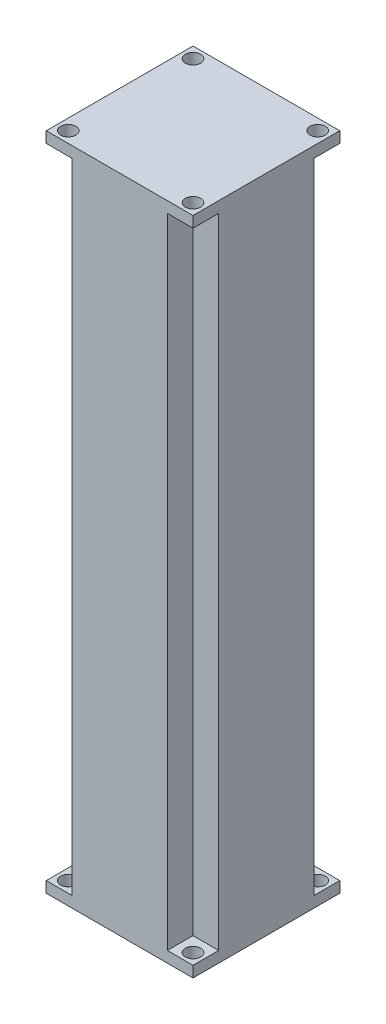
ISO-10303-21;
HEADER;
FILE_DESCRIPTION(('STEP AP214'),'2;1');
FILE_NAME('part.step','',(''),(''),'','','');
FILE_SCHEMA(('AUTOMOTIVE_DESIGN { 1 0 10303 214 1 1 1 1 }'));
ENDSEC;
DATA;
#1=APPLICATION_CONTEXT('core data for automotive mechanical design processes');
#2=APPLICATION_PROTOCOL_DEFINITION('international standard','automotive_design',2000,#1);
#3=PRODUCT_CONTEXT('',#1,'mechanical');
#4=PRODUCT('Part','Part','',(#3));
#5=PRODUCT_RELATED_PRODUCT_CATEGORY('part','',(#4));
#6=PRODUCT_DEFINITION_FORMATION('','',#4);
#7=PRODUCT_DEFINITION_CONTEXT('part definition',#1,'design');
#8=PRODUCT_DEFINITION('design','',#6,#7);
#9=PRODUCT_DEFINITION_SHAPE('','',#8);
#10=(LENGTH_UNIT() NAMED_UNIT(*) SI_UNIT(.MILLI.,.METRE.));
#11=(NAMED_UNIT(*) PLANE_ANGLE_UNIT() SI_UNIT($,.RADIAN.));
#12=(NAMED_UNIT(*) SI_UNIT($,.STERADIAN.) SOLID_ANGLE_UNIT());
#13=UNCERTAINTY_MEASURE_WITH_UNIT(LENGTH_MEASURE(1.E-05),#10,'distance_accuracy_value','');
#14=(GEOMETRIC_REPRESENTATION_CONTEXT(3) GLOBAL_UNCERTAINTY_ASSIGNED_CONTEXT((#13)) GLOBAL_UNIT_ASSIGNED_CONTEXT((#10,
#11,#12)) REPRESENTATION_CONTEXT('',''));
#15=CARTESIAN_POINT('',(0.,0.,0.));
#16=DIRECTION('',(0.,0.,1.));
#17=DIRECTION('',(1.,0.,0.));
#18=AXIS2_PLACEMENT_3D('',#15,#16,#17);
#19=CARTESIAN_POINT('',(-25.4,228.6,25.4));
#20=DIRECTION('',(-1.,0.,0.));
#21=DIRECTION('',(0.,0.,1.));
#22=AXIS2_PLACEMENT_3D('',#19,#20,#21);
#23=PLANE('',#22);
#24=DIRECTION('',(0.,1.,0.));
#25=VECTOR('',#24,1.);
#26=CARTESIAN_POINT('',(-25.4,3.81000000000001,-16.51));
#27=LINE('',#26,#25);
#28=CARTESIAN_POINT('',(-25.4,3.81000000000001,-16.51));
#29=VERTEX_POINT('',#28);
#30=CARTESIAN_POINT('',(-25.4,224.79,-16.51));
#31=VERTEX_POINT('',#30);
#32=EDGE_CURVE('E187',#29,#31,#27,.T.);
#33=ORIENTED_EDGE('',*,*,#32,.F.);
#34=DIRECTION('',(0.,0.,-1.));
#35=VECTOR('',#34,1.);
#36=CARTESIAN_POINT('',(-25.4,3.81000000000001,-16.51));
#37=LINE('',#36,#35);
#38=CARTESIAN_POINT('',(-25.4,3.81000000000001,-25.4));
#39=VERTEX_POINT('',#38);
#40=EDGE_CURVE('E225',#29,#39,#37,.T.);
#41=ORIENTED_EDGE('',*,*,#40,.T.);
#42=DIRECTION('',(0.,-1.,0.));
#43=VECTOR('',#42,1.);
#44=CARTESIAN_POINT('',(-25.4,228.6,-25.4));
#45=LINE('',#44,#43);
#46=CARTESIAN_POINT('',(-25.4,0.,-25.4));
#47=VERTEX_POINT('',#46);
#48=EDGE_CURVE('E329',#39,#47,#45,.T.);
#49=ORIENTED_EDGE('',*,*,#48,.T.);
#50=DIRECTION('',(0.,0.,-1.));
#51=VECTOR('',#50,1.);
#52=CARTESIAN_POINT('',(-25.4,0.,25.4));
#53=LINE('',#52,#51);
#54=CARTESIAN_POINT('',(-25.4,0.,25.4));
#55=VERTEX_POINT('',#54);
#56=EDGE_CURVE('E314',#55,#47,#53,.T.);
#57=ORIENTED_EDGE('',*,*,#56,.F.);
#58=DIRECTION('',(0.,-1.,0.));
#59=VECTOR('',#58,1.);
#60=CARTESIAN_POINT('',(-25.4,228.6,25.4));
#61=LINE('',#60,#59);
#62=CARTESIAN_POINT('',(-25.4,3.81000000000001,25.4));
#63=VERTEX_POINT('',#62);
#64=EDGE_CURVE('E315',#63,#55,#61,.T.);
#65=ORIENTED_EDGE('',*,*,#64,.F.);
#66=DIRECTION('',(0.,0.,1.));
#67=VECTOR('',#66,1.);
#68=CARTESIAN_POINT('',(-25.4,3.81000000000001,16.51));
#69=LINE('',#68,#67);
#70=CARTESIAN_POINT('',(-25.4,3.81000000000001,16.51));
#71=VERTEX_POINT('',#70);
#72=EDGE_CURVE('E216',#71,#63,#69,.T.);
#73=ORIENTED_EDGE('',*,*,#72,.F.);
#74=DIRECTION('',(0.,1.,0.));
#75=VECTOR('',#74,1.);
#76=CARTESIAN_POINT('',(-25.4,3.81000000000001,16.51));
#77=LINE('',#76,#75);
#78=CARTESIAN_POINT('',(-25.4,224.79,16.51));
#79=VERTEX_POINT('',#78);
#80=EDGE_CURVE('E210',#71,#79,#77,.T.);
#81=ORIENTED_EDGE('',*,*,#80,.T.);
#82=DIRECTION('',(0.,0.,1.));
#83=VECTOR('',#82,1.);
#84=CARTESIAN_POINT('',(-25.4,224.79,16.51));
#85=LINE('',#84,#83);
#86=CARTESIAN_POINT('',(-25.4,224.79,25.4));
#87=VERTEX_POINT('',#86);
#88=EDGE_CURVE('E61',#79,#87,#85,.T.);
#89=ORIENTED_EDGE('',*,*,#88,.T.);
#90=CARTESIAN_POINT('',(-25.4,228.6,25.4));
#91=VERTEX_POINT('',#90);
#92=EDGE_CURVE('E43',#91,#87,#61,.T.);
#93=ORIENTED_EDGE('',*,*,#92,.F.);
#94=DIRECTION('',(0.,0.,-1.));
#95=VECTOR('',#94,1.);
#96=CARTESIAN_POINT('',(-25.4,228.6,25.4));
#97=LINE('',#96,#95);
#98=CARTESIAN_POINT('',(-25.4,228.6,-25.4));
#99=VERTEX_POINT('',#98);
#100=EDGE_CURVE('E304',#91,#99,#97,.T.);
#101=ORIENTED_EDGE('',*,*,#100,.T.);
#102=CARTESIAN_POINT('',(-25.4,224.79,-25.4));
#103=VERTEX_POINT('',#102);
#104=EDGE_CURVE('E197',#99,#103,#45,.T.);
#105=ORIENTED_EDGE('',*,*,#104,.T.);
#106=DIRECTION('',(0.,0.,-1.));
#107=VECTOR('',#106,1.);
#108=CARTESIAN_POINT('',(-25.4,224.79,-16.51));
#109=LINE('',#108,#107);
#110=EDGE_CURVE('E179',#31,#103,#109,.T.);
#111=ORIENTED_EDGE('',*,*,#110,.F.);
#112=EDGE_LOOP('',(#33,#41,#49,#57,#65,#73,#81,#89,#93,#101,#105,#111));
#113=FACE_BOUND('',#112,.T.);
#114=ADVANCED_FACE('F39',(#113),#23,.T.);
#115=CARTESIAN_POINT('',(25.4,228.6,-25.4));
#116=DIRECTION('',(0.,0.,1.));
#117=DIRECTION('',(1.,0.,0.));
#118=AXIS2_PLACEMENT_3D('',#115,#116,#117);
#119=PLANE('',#118);
#120=DIRECTION('',(1.,0.,0.));
#121=VECTOR('',#120,1.);
#122=CARTESIAN_POINT('',(-25.4,224.79,-25.4));
#123=LINE('',#122,#121);
#124=CARTESIAN_POINT('',(-16.51,224.79,-25.4));
#125=VERTEX_POINT('',#124);
#126=EDGE_CURVE('E57',#103,#125,#123,.T.);
#127=ORIENTED_EDGE('',*,*,#126,.F.);
#128=ORIENTED_EDGE('',*,*,#104,.F.);
#129=DIRECTION('',(-1.,0.,0.));
#130=VECTOR('',#129,1.);
#131=CARTESIAN_POINT('',(25.4,228.6,-25.4));
#132=LINE('',#131,#130);
#133=CARTESIAN_POINT('',(25.4,228.6,-25.4));
#134=VERTEX_POINT('',#133);
#135=EDGE_CURVE('E308',#134,#99,#132,.T.);
#136=ORIENTED_EDGE('',*,*,#135,.F.);
#137=DIRECTION('',(0.,-1.,0.));
#138=VECTOR('',#137,1.);
#139=CARTESIAN_POINT('',(25.4,228.6,-25.4));
#140=LINE('',#139,#138);
#141=CARTESIAN_POINT('',(25.4,224.79,-25.4));
#142=VERTEX_POINT('',#141);
#143=EDGE_CURVE('E324',#134,#142,#140,.T.);
#144=ORIENTED_EDGE('',*,*,#143,.T.);
#145=DIRECTION('',(-1.,0.,0.));
#146=VECTOR('',#145,1.);
#147=CARTESIAN_POINT('',(25.4,224.79,-25.4));
#148=LINE('',#147,#146);
#149=CARTESIAN_POINT('',(16.51,224.79,-25.4));
#150=VERTEX_POINT('',#149);
#151=EDGE_CURVE('E238',#142,#150,#148,.T.);
#152=ORIENTED_EDGE('',*,*,#151,.T.);
#153=DIRECTION('',(0.,-1.,0.));
#154=VECTOR('',#153,1.);
#155=CARTESIAN_POINT('',(16.51,3.81,-25.4));
#156=LINE('',#155,#154);
#157=CARTESIAN_POINT('',(16.51,3.81000000000001,-25.4));
#158=VERTEX_POINT('',#157);
#159=EDGE_CURVE('E250',#150,#158,#156,.T.);
#160=ORIENTED_EDGE('',*,*,#159,.T.);
#161=DIRECTION('',(1.,0.,0.));
#162=VECTOR('',#161,1.);
#163=CARTESIAN_POINT('',(25.4,3.81000000000001,-25.4));
#164=LINE('',#163,#162);
#165=CARTESIAN_POINT('',(25.4,3.81000000000001,-25.4));
#166=VERTEX_POINT('',#165);
#167=EDGE_CURVE('E226',#158,#166,#164,.T.);
#168=ORIENTED_EDGE('',*,*,#167,.T.);
#169=CARTESIAN_POINT('',(25.4,0.,-25.4));
#170=VERTEX_POINT('',#169);
#171=EDGE_CURVE('E323',#166,#170,#140,.T.);
#172=ORIENTED_EDGE('',*,*,#171,.T.);
#173=DIRECTION('',(-1.,0.,0.));
#174=VECTOR('',#173,1.);
#175=CARTESIAN_POINT('',(25.4,0.,-25.4));
#176=LINE('',#175,#174);
#177=EDGE_CURVE('E319',#170,#47,#176,.T.);
#178=ORIENTED_EDGE('',*,*,#177,.T.);
#179=ORIENTED_EDGE('',*,*,#48,.F.);
#180=DIRECTION('',(-1.,0.,0.));
#181=VECTOR('',#180,1.);
#182=CARTESIAN_POINT('',(-25.4,3.81000000000001,-25.4));
#183=LINE('',#182,#181);
#184=CARTESIAN_POINT('',(-16.51,3.81,-25.4));
#185=VERTEX_POINT('',#184);
#186=EDGE_CURVE('E193',#185,#39,#183,.T.);
#187=ORIENTED_EDGE('',*,*,#186,.F.);
#188=DIRECTION('',(0.,-1.,0.));
#189=VECTOR('',#188,1.);
#190=CARTESIAN_POINT('',(-16.51,3.81,-25.4));
#191=LINE('',#190,#189);
#192=EDGE_CURVE('E456',#125,#185,#191,.T.);
#193=ORIENTED_EDGE('',*,*,#192,.F.);
#194=EDGE_LOOP('',(#127,#128,#136,#144,#152,#160,#168,#172,#178,#179,#187,#193));
#195=FACE_BOUND('',#194,.T.);
#196=ADVANCED_FACE('F394',(#195),#119,.F.);
#197=CARTESIAN_POINT('',(25.4,228.6,25.4));
#198=DIRECTION('',(0.,0.,1.));
#199=DIRECTION('',(1.,0.,0.));
#200=AXIS2_PLACEMENT_3D('',#197,#198,#199);
#201=PLANE('',#200);
#202=DIRECTION('',(0.,-1.,0.));
#203=VECTOR('',#202,1.);
#204=CARTESIAN_POINT('',(-16.51,3.81,25.4));
#205=LINE('',#204,#203);
#206=CARTESIAN_POINT('',(-16.51,224.79,25.4));
#207=VERTEX_POINT('',#206);
#208=CARTESIAN_POINT('',(-16.51,3.81,25.4));
#209=VERTEX_POINT('',#208);
#210=EDGE_CURVE('E222',#207,#209,#205,.T.);
#211=ORIENTED_EDGE('',*,*,#210,.T.);
#212=DIRECTION('',(-1.,0.,0.));
#213=VECTOR('',#212,1.);
#214=CARTESIAN_POINT('',(-25.4,3.81000000000001,25.4));
#215=LINE('',#214,#213);
#216=EDGE_CURVE('E220',#209,#63,#215,.T.);
#217=ORIENTED_EDGE('',*,*,#216,.T.);
#218=ORIENTED_EDGE('',*,*,#64,.T.);
#219=DIRECTION('',(-1.,0.,0.));
#220=VECTOR('',#219,1.);
#221=CARTESIAN_POINT('',(25.4,0.,25.4));
#222=LINE('',#221,#220);
#223=CARTESIAN_POINT('',(25.4,0.,25.4));
#224=VERTEX_POINT('',#223);
#225=EDGE_CURVE('E298',#224,#55,#222,.T.);
#226=ORIENTED_EDGE('',*,*,#225,.F.);
#227=DIRECTION('',(0.,-1.,0.));
#228=VECTOR('',#227,1.);
#229=CARTESIAN_POINT('',(25.4,228.6,25.4));
#230=LINE('',#229,#228);
#231=CARTESIAN_POINT('',(25.4,3.81000000000001,25.4));
#232=VERTEX_POINT('',#231);
#233=EDGE_CURVE('E48',#232,#224,#230,.T.);
#234=ORIENTED_EDGE('',*,*,#233,.F.);
#235=DIRECTION('',(1.,0.,0.));
#236=VECTOR('',#235,1.);
#237=CARTESIAN_POINT('',(25.4,3.81000000000001,25.4));
#238=LINE('',#237,#236);
#239=CARTESIAN_POINT('',(16.51,3.81,25.4));
#240=VERTEX_POINT('',#239);
#241=EDGE_CURVE('E279',#240,#232,#238,.T.);
#242=ORIENTED_EDGE('',*,*,#241,.F.);
#243=DIRECTION('',(0.,-1.,0.));
#244=VECTOR('',#243,1.);
#245=CARTESIAN_POINT('',(16.51,3.81,25.4));
#246=LINE('',#245,#244);
#247=CARTESIAN_POINT('',(16.51,224.79,25.4));
#248=VERTEX_POINT('',#247);
#249=EDGE_CURVE('E286',#248,#240,#246,.T.);
#250=ORIENTED_EDGE('',*,*,#249,.F.);
#251=DIRECTION('',(-1.,0.,0.));
#252=VECTOR('',#251,1.);
#253=CARTESIAN_POINT('',(25.4,224.79,25.4));
#254=LINE('',#253,#252);
#255=CARTESIAN_POINT('',(25.4,224.79,25.4));
#256=VERTEX_POINT('',#255);
#257=EDGE_CURVE('E271',#256,#248,#254,.T.);
#258=ORIENTED_EDGE('',*,*,#257,.F.);
#259=CARTESIAN_POINT('',(25.4,228.6,25.4));
#260=VERTEX_POINT('',#259);
#261=EDGE_CURVE('E11',#260,#256,#230,.T.);
#262=ORIENTED_EDGE('',*,*,#261,.F.);
#263=DIRECTION('',(-1.,0.,0.));
#264=VECTOR('',#263,1.);
#265=CARTESIAN_POINT('',(25.4,228.6,25.4));
#266=LINE('',#265,#264);
#267=EDGE_CURVE('E305',#260,#91,#266,.T.);
#268=ORIENTED_EDGE('',*,*,#267,.T.);
#269=ORIENTED_EDGE('',*,*,#92,.T.);
#270=DIRECTION('',(1.,0.,0.));
#271=VECTOR('',#270,1.);
#272=CARTESIAN_POINT('',(-25.4,224.79,25.4));
#273=LINE('',#272,#271);
#274=EDGE_CURVE('E212',#87,#207,#273,.T.);
#275=ORIENTED_EDGE('',*,*,#274,.T.);
#276=EDGE_LOOP('',(#211,#217,#218,#226,#234,#242,#250,#258,#262,#268,#269,#275));
#277=FACE_BOUND('',#276,.T.);
#278=ADVANCED_FACE('F41',(#277),#201,.T.);
#279=CARTESIAN_POINT('',(25.4,228.6,25.4));
#280=DIRECTION('',(-1.,0.,0.));
#281=DIRECTION('',(0.,0.,1.));
#282=AXIS2_PLACEMENT_3D('',#279,#280,#281);
#283=PLANE('',#282);
#284=DIRECTION('',(0.,1.,0.));
#285=VECTOR('',#284,1.);
#286=CARTESIAN_POINT('',(25.4,3.81000000000001,-16.51));
#287=LINE('',#286,#285);
#288=CARTESIAN_POINT('',(25.4,3.81000000000001,-16.51));
#289=VERTEX_POINT('',#288);
#290=CARTESIAN_POINT('',(25.4,224.79,-16.51));
#291=VERTEX_POINT('',#290);
#292=EDGE_CURVE('E234',#289,#291,#287,.T.);
#293=ORIENTED_EDGE('',*,*,#292,.T.);
#294=DIRECTION('',(0.,0.,-1.));
#295=VECTOR('',#294,1.);
#296=CARTESIAN_POINT('',(25.4,224.79,-16.51));
#297=LINE('',#296,#295);
#298=EDGE_CURVE('E255',#291,#142,#297,.T.);
#299=ORIENTED_EDGE('',*,*,#298,.T.);
#300=ORIENTED_EDGE('',*,*,#143,.F.);
#301=DIRECTION('',(0.,0.,-1.));
#302=VECTOR('',#301,1.);
#303=CARTESIAN_POINT('',(25.4,228.6,25.4));
#304=LINE('',#303,#302);
#305=EDGE_CURVE('E309',#260,#134,#304,.T.);
#306=ORIENTED_EDGE('',*,*,#305,.F.);
#307=ORIENTED_EDGE('',*,*,#261,.T.);
#308=DIRECTION('',(0.,0.,1.));
#309=VECTOR('',#308,1.);
#310=CARTESIAN_POINT('',(25.4,224.79,16.51));
#311=LINE('',#310,#309);
#312=CARTESIAN_POINT('',(25.4,224.79,16.51));
#313=VERTEX_POINT('',#312);
#314=EDGE_CURVE('E287',#313,#256,#311,.T.);
#315=ORIENTED_EDGE('',*,*,#314,.F.);
#316=DIRECTION('',(0.,1.,0.));
#317=VECTOR('',#316,1.);
#318=CARTESIAN_POINT('',(25.4,3.81000000000001,16.51));
#319=LINE('',#318,#317);
#320=CARTESIAN_POINT('',(25.4,3.81000000000001,16.51));
#321=VERTEX_POINT('',#320);
#322=EDGE_CURVE('E274',#321,#313,#319,.T.);
#323=ORIENTED_EDGE('',*,*,#322,.F.);
#324=DIRECTION('',(0.,0.,1.));
#325=VECTOR('',#324,1.);
#326=CARTESIAN_POINT('',(25.4,3.81000000000001,16.51));
#327=LINE('',#326,#325);
#328=EDGE_CURVE('E291',#321,#232,#327,.T.);
#329=ORIENTED_EDGE('',*,*,#328,.T.);
#330=ORIENTED_EDGE('',*,*,#233,.T.);
#331=DIRECTION('',(0.,0.,-1.));
#332=VECTOR('',#331,1.);
#333=CARTESIAN_POINT('',(25.4,0.,25.4));
#334=LINE('',#333,#332);
#335=EDGE_CURVE('E306',#224,#170,#334,.T.);
#336=ORIENTED_EDGE('',*,*,#335,.T.);
#337=ORIENTED_EDGE('',*,*,#171,.F.);
#338=DIRECTION('',(0.,0.,-1.));
#339=VECTOR('',#338,1.);
#340=CARTESIAN_POINT('',(25.4,3.81000000000001,-16.51));
#341=LINE('',#340,#339);
#342=EDGE_CURVE('E242',#289,#166,#341,.T.);
#343=ORIENTED_EDGE('',*,*,#342,.F.);
#344=EDGE_LOOP('',(#293,#299,#300,#306,#307,#315,#323,#329,#330,#336,#337,#343));
#345=FACE_BOUND('',#344,.T.);
#346=ADVANCED_FACE('F345',(#345),#283,.F.);
#347=CARTESIAN_POINT('',(0.,228.6,0.));
#348=DIRECTION('',(0.,-1.,0.));
#349=DIRECTION('',(0.,0.,-1.));
#350=AXIS2_PLACEMENT_3D('',#347,#348,#349);
#351=PLANE('',#350);
#352=CARTESIAN_POINT('',(-21.59,228.6,-21.59));
#353=DIRECTION('',(0.,-1.,0.));
#354=DIRECTION('',(0.,0.,-1.));
#355=AXIS2_PLACEMENT_3D('',#352,#353,#354);
#356=CIRCLE('',#355,2.6543);
#357=CARTESIAN_POINT('',(-21.59,228.6,-24.2443));
#358=VERTEX_POINT('',#357);
#359=EDGE_CURVE('E500',#358,#358,#356,.T.);
#360=ORIENTED_EDGE('',*,*,#359,.T.);
#361=EDGE_LOOP('',(#360));
#362=FACE_BOUND('',#361,.T.);
#363=CARTESIAN_POINT('',(-21.59,228.6,21.59));
#364=DIRECTION('',(0.,-1.,0.));
#365=DIRECTION('',(0.,0.,-1.));
#366=AXIS2_PLACEMENT_3D('',#363,#364,#365);
#367=CIRCLE('',#366,2.6543);
#368=CARTESIAN_POINT('',(-21.59,228.6,18.9357));
#369=VERTEX_POINT('',#368);
#370=EDGE_CURVE('E493',#369,#369,#367,.T.);
#371=ORIENTED_EDGE('',*,*,#370,.T.);
#372=EDGE_LOOP('',(#371));
#373=FACE_BOUND('',#372,.T.);
#374=CARTESIAN_POINT('',(21.59,228.6,-21.59));
#375=DIRECTION('',(0.,-1.,0.));
#376=DIRECTION('',(0.,0.,-1.));
#377=AXIS2_PLACEMENT_3D('',#374,#375,#376);
#378=CIRCLE('',#377,2.6543);
#379=CARTESIAN_POINT('',(21.59,228.6,-24.2443));
#380=VERTEX_POINT('',#379);
#381=EDGE_CURVE('E483',#380,#380,#378,.T.);
#382=ORIENTED_EDGE('',*,*,#381,.T.);
#383=EDGE_LOOP('',(#382));
#384=FACE_BOUND('',#383,.T.);
#385=CARTESIAN_POINT('',(21.59,228.6,21.59));
#386=DIRECTION('',(0.,-1.,0.));
#387=DIRECTION('',(0.,0.,-1.));
#388=AXIS2_PLACEMENT_3D('',#385,#386,#387);
#389=CIRCLE('',#388,2.6543);
#390=CARTESIAN_POINT('',(21.59,228.6,18.9357));
#391=VERTEX_POINT('',#390);
#392=EDGE_CURVE('E263',#391,#391,#389,.T.);
#393=ORIENTED_EDGE('',*,*,#392,.T.);
#394=EDGE_LOOP('',(#393));
#395=FACE_BOUND('',#394,.T.);
#396=ORIENTED_EDGE('',*,*,#267,.F.);
#397=ORIENTED_EDGE('',*,*,#305,.T.);
#398=ORIENTED_EDGE('',*,*,#135,.T.);
#399=ORIENTED_EDGE('',*,*,#100,.F.);
#400=EDGE_LOOP('',(#396,#397,#398,#399));
#401=FACE_BOUND('',#400,.T.);
#402=ADVANCED_FACE('F364',(#362,#373,#384,#395,#401),#351,.F.);
#403=CARTESIAN_POINT('',(0.,0.,0.));
#404=DIRECTION('',(0.,-1.,0.));
#405=DIRECTION('',(0.,0.,-1.));
#406=AXIS2_PLACEMENT_3D('',#403,#404,#405);
#407=PLANE('',#406);
#408=CARTESIAN_POINT('',(-21.59,0.,-21.59));
#409=DIRECTION('',(0.,1.,0.));
#410=DIRECTION('',(0.,0.,1.));
#411=AXIS2_PLACEMENT_3D('',#408,#409,#410);
#412=CIRCLE('',#411,2.6543);
#413=CARTESIAN_POINT('',(-21.59,0.,-18.9357));
#414=VERTEX_POINT('',#413);
#415=EDGE_CURVE('E478',#414,#414,#412,.T.);
#416=ORIENTED_EDGE('',*,*,#415,.T.);
#417=EDGE_LOOP('',(#416));
#418=FACE_BOUND('',#417,.T.);
#419=CARTESIAN_POINT('',(-21.59,0.,21.59));
#420=DIRECTION('',(0.,1.,0.));
#421=DIRECTION('',(0.,0.,1.));
#422=AXIS2_PLACEMENT_3D('',#419,#420,#421);
#423=CIRCLE('',#422,2.6543);
#424=CARTESIAN_POINT('',(-21.59,0.,24.2443));
#425=VERTEX_POINT('',#424);
#426=EDGE_CURVE('E474',#425,#425,#423,.T.);
#427=ORIENTED_EDGE('',*,*,#426,.T.);
#428=EDGE_LOOP('',(#427));
#429=FACE_BOUND('',#428,.T.);
#430=CARTESIAN_POINT('',(21.59,0.,-21.59));
#431=DIRECTION('',(0.,1.,0.));
#432=DIRECTION('',(0.,0.,1.));
#433=AXIS2_PLACEMENT_3D('',#430,#431,#432);
#434=CIRCLE('',#433,2.6543);
#435=CARTESIAN_POINT('',(21.59,0.,-18.9357));
#436=VERTEX_POINT('',#435);
#437=EDGE_CURVE('E460',#436,#436,#434,.T.);
#438=ORIENTED_EDGE('',*,*,#437,.T.);
#439=EDGE_LOOP('',(#438));
#440=FACE_BOUND('',#439,.T.);
#441=CARTESIAN_POINT('',(21.59,0.,21.59));
#442=DIRECTION('',(0.,1.,0.));
#443=DIRECTION('',(0.,0.,1.));
#444=AXIS2_PLACEMENT_3D('',#441,#442,#443);
#445=CIRCLE('',#444,2.6543);
#446=CARTESIAN_POINT('',(21.59,0.,24.2443));
#447=VERTEX_POINT('',#446);
#448=EDGE_CURVE('E268',#447,#447,#445,.T.);
#449=ORIENTED_EDGE('',*,*,#448,.T.);
#450=EDGE_LOOP('',(#449));
#451=FACE_BOUND('',#450,.T.);
#452=ORIENTED_EDGE('',*,*,#225,.T.);
#453=ORIENTED_EDGE('',*,*,#56,.T.);
#454=ORIENTED_EDGE('',*,*,#177,.F.);
#455=ORIENTED_EDGE('',*,*,#335,.F.);
#456=EDGE_LOOP('',(#452,#453,#454,#455));
#457=FACE_BOUND('',#456,.T.);
#458=ADVANCED_FACE('F339',(#418,#429,#440,#451,#457),#407,.T.);
#459=CARTESIAN_POINT('',(25.4,3.81000000000001,16.51));
#460=DIRECTION('',(0.,-1.,0.));
#461=DIRECTION('',(1.,0.,0.));
#462=AXIS2_PLACEMENT_3D('',#459,#460,#461);
#463=PLANE('',#462);
#464=CARTESIAN_POINT('',(21.59,3.81,21.59));
#465=DIRECTION('',(0.,1.,0.));
#466=DIRECTION('',(0.,0.,1.));
#467=AXIS2_PLACEMENT_3D('',#464,#465,#466);
#468=CIRCLE('',#467,2.65429999999999);
#469=CARTESIAN_POINT('',(21.59,3.81,24.2443));
#470=VERTEX_POINT('',#469);
#471=EDGE_CURVE('E270',#470,#470,#468,.T.);
#472=ORIENTED_EDGE('',*,*,#471,.F.);
#473=EDGE_LOOP('',(#472));
#474=FACE_BOUND('',#473,.T.);
#475=ORIENTED_EDGE('',*,*,#241,.T.);
#476=ORIENTED_EDGE('',*,*,#328,.F.);
#477=DIRECTION('',(1.,0.,0.));
#478=VECTOR('',#477,1.);
#479=CARTESIAN_POINT('',(25.4,3.81000000000001,16.51));
#480=LINE('',#479,#478);
#481=CARTESIAN_POINT('',(16.51,3.81,16.51));
#482=VERTEX_POINT('',#481);
#483=EDGE_CURVE('E283',#482,#321,#480,.T.);
#484=ORIENTED_EDGE('',*,*,#483,.F.);
#485=DIRECTION('',(0.,0.,1.));
#486=VECTOR('',#485,1.);
#487=CARTESIAN_POINT('',(16.51,3.81,16.51));
#488=LINE('',#487,#486);
#489=EDGE_CURVE('E300',#482,#240,#488,.T.);
#490=ORIENTED_EDGE('',*,*,#489,.T.);
#491=EDGE_LOOP('',(#475,#476,#484,#490));
#492=FACE_BOUND('',#491,.T.);
#493=ADVANCED_FACE('F347',(#474,#492),#463,.F.);
#494=CARTESIAN_POINT('',(16.51,3.81,16.51));
#495=DIRECTION('',(-1.,0.,0.));
#496=DIRECTION('',(0.,0.,1.));
#497=AXIS2_PLACEMENT_3D('',#494,#495,#496);
#498=PLANE('',#497);
#499=ORIENTED_EDGE('',*,*,#249,.T.);
#500=ORIENTED_EDGE('',*,*,#489,.F.);
#501=DIRECTION('',(0.,-1.,0.));
#502=VECTOR('',#501,1.);
#503=CARTESIAN_POINT('',(16.51,3.81,16.51));
#504=LINE('',#503,#502);
#505=CARTESIAN_POINT('',(16.51,224.79,16.51));
#506=VERTEX_POINT('',#505);
#507=EDGE_CURVE('E284',#506,#482,#504,.T.);
#508=ORIENTED_EDGE('',*,*,#507,.F.);
#509=DIRECTION('',(0.,0.,1.));
#510=VECTOR('',#509,1.);
#511=CARTESIAN_POINT('',(16.51,224.79,16.51));
#512=LINE('',#511,#510);
#513=EDGE_CURVE('E299',#506,#248,#512,.T.);
#514=ORIENTED_EDGE('',*,*,#513,.T.);
#515=EDGE_LOOP('',(#499,#500,#508,#514));
#516=FACE_BOUND('',#515,.T.);
#517=ADVANCED_FACE('F351',(#516),#498,.F.);
#518=CARTESIAN_POINT('',(25.4,224.79,16.51));
#519=DIRECTION('',(0.,1.,0.));
#520=DIRECTION('',(0.,0.,1.));
#521=AXIS2_PLACEMENT_3D('',#518,#519,#520);
#522=PLANE('',#521);
#523=CARTESIAN_POINT('',(21.59,224.79,21.59));
#524=DIRECTION('',(0.,-1.,0.));
#525=DIRECTION('',(0.,0.,-1.));
#526=AXIS2_PLACEMENT_3D('',#523,#524,#525);
#527=CIRCLE('',#526,2.65429999999999);
#528=CARTESIAN_POINT('',(21.59,224.79,18.9357));
#529=VERTEX_POINT('',#528);
#530=EDGE_CURVE('E253',#529,#529,#527,.T.);
#531=ORIENTED_EDGE('',*,*,#530,.F.);
#532=EDGE_LOOP('',(#531));
#533=FACE_BOUND('',#532,.T.);
#534=ORIENTED_EDGE('',*,*,#257,.T.);
#535=ORIENTED_EDGE('',*,*,#513,.F.);
#536=DIRECTION('',(-1.,0.,0.));
#537=VECTOR('',#536,1.);
#538=CARTESIAN_POINT('',(25.4,224.79,16.51));
#539=LINE('',#538,#537);
#540=EDGE_CURVE('E280',#313,#506,#539,.T.);
#541=ORIENTED_EDGE('',*,*,#540,.F.);
#542=ORIENTED_EDGE('',*,*,#314,.T.);
#543=EDGE_LOOP('',(#534,#535,#541,#542));
#544=FACE_BOUND('',#543,.T.);
#545=ADVANCED_FACE('F358',(#533,#544),#522,.F.);
#546=CARTESIAN_POINT('',(0.,0.,16.51));
#547=DIRECTION('',(0.,0.,1.));
#548=DIRECTION('',(1.,0.,0.));
#549=AXIS2_PLACEMENT_3D('',#546,#547,#548);
#550=PLANE('',#549);
#551=ORIENTED_EDGE('',*,*,#322,.T.);
#552=ORIENTED_EDGE('',*,*,#540,.T.);
#553=ORIENTED_EDGE('',*,*,#507,.T.);
#554=ORIENTED_EDGE('',*,*,#483,.T.);
#555=EDGE_LOOP('',(#551,#552,#553,#554));
#556=FACE_BOUND('',#555,.T.);
#557=ADVANCED_FACE('F406',(#556),#550,.T.);
#558=CARTESIAN_POINT('',(21.59,3.81,21.59));
#559=DIRECTION('',(0.,1.,0.));
#560=DIRECTION('',(0.,0.,1.));
#561=AXIS2_PLACEMENT_3D('',#558,#559,#560);
#562=CYLINDRICAL_SURFACE('',#561,2.65429999999999);
#563=ORIENTED_EDGE('',*,*,#448,.F.);
#564=EDGE_LOOP('',(#563));
#565=FACE_BOUND('',#564,.T.);
#566=ORIENTED_EDGE('',*,*,#471,.T.);
#567=EDGE_LOOP('',(#566));
#568=FACE_BOUND('',#567,.T.);
#569=ADVANCED_FACE('F419',(#565,#568),#562,.F.);
#570=CARTESIAN_POINT('',(21.59,224.79,21.59));
#571=DIRECTION('',(0.,-1.,0.));
#572=DIRECTION('',(0.,0.,-1.));
#573=AXIS2_PLACEMENT_3D('',#570,#571,#572);
#574=CYLINDRICAL_SURFACE('',#573,2.65429999999999);
#575=ORIENTED_EDGE('',*,*,#392,.F.);
#576=EDGE_LOOP('',(#575));
#577=FACE_BOUND('',#576,.T.);
#578=ORIENTED_EDGE('',*,*,#530,.T.);
#579=EDGE_LOOP('',(#578));
#580=FACE_BOUND('',#579,.T.);
#581=ADVANCED_FACE('F422',(#577,#580),#574,.F.);
#582=CARTESIAN_POINT('',(25.4,224.79,-16.51));
#583=DIRECTION('',(0.,-1.,0.));
#584=DIRECTION('',(0.,0.,-1.));
#585=AXIS2_PLACEMENT_3D('',#582,#583,#584);
#586=PLANE('',#585);
#587=CARTESIAN_POINT('',(21.59,224.79,-21.59));
#588=DIRECTION('',(0.,-1.,0.));
#589=DIRECTION('',(0.,0.,-1.));
#590=AXIS2_PLACEMENT_3D('',#587,#588,#589);
#591=CIRCLE('',#590,2.65429999999999);
#592=CARTESIAN_POINT('',(21.59,224.79,-24.2443));
#593=VERTEX_POINT('',#592);
#594=EDGE_CURVE('E486',#593,#593,#591,.T.);
#595=ORIENTED_EDGE('',*,*,#594,.F.);
#596=EDGE_LOOP('',(#595));
#597=FACE_BOUND('',#596,.T.);
#598=ORIENTED_EDGE('',*,*,#151,.F.);
#599=ORIENTED_EDGE('',*,*,#298,.F.);
#600=DIRECTION('',(-1.,0.,0.));
#601=VECTOR('',#600,1.);
#602=CARTESIAN_POINT('',(25.4,224.79,-16.51));
#603=LINE('',#602,#601);
#604=CARTESIAN_POINT('',(16.51,224.79,-16.51));
#605=VERTEX_POINT('',#604);
#606=EDGE_CURVE('E245',#291,#605,#603,.T.);
#607=ORIENTED_EDGE('',*,*,#606,.T.);
#608=DIRECTION('',(0.,0.,-1.));
#609=VECTOR('',#608,1.);
#610=CARTESIAN_POINT('',(16.51,224.79,-16.51));
#611=LINE('',#610,#609);
#612=EDGE_CURVE('E257',#605,#150,#611,.T.);
#613=ORIENTED_EDGE('',*,*,#612,.T.);
#614=EDGE_LOOP('',(#598,#599,#607,#613));
#615=FACE_BOUND('',#614,.T.);
#616=ADVANCED_FACE('F424',(#597,#615),#586,.T.);
#617=CARTESIAN_POINT('',(16.51,3.81,-16.51));
#618=DIRECTION('',(1.,0.,0.));
#619=DIRECTION('',(0.,0.,-1.));
#620=AXIS2_PLACEMENT_3D('',#617,#618,#619);
#621=PLANE('',#620);
#622=ORIENTED_EDGE('',*,*,#159,.F.);
#623=ORIENTED_EDGE('',*,*,#612,.F.);
#624=DIRECTION('',(0.,-1.,0.));
#625=VECTOR('',#624,1.);
#626=CARTESIAN_POINT('',(16.51,3.81,-16.51));
#627=LINE('',#626,#625);
#628=CARTESIAN_POINT('',(16.51,3.81,-16.51));
#629=VERTEX_POINT('',#628);
#630=EDGE_CURVE('E239',#605,#629,#627,.T.);
#631=ORIENTED_EDGE('',*,*,#630,.T.);
#632=DIRECTION('',(0.,0.,-1.));
#633=VECTOR('',#632,1.);
#634=CARTESIAN_POINT('',(16.51,3.81,-16.51));
#635=LINE('',#634,#633);
#636=EDGE_CURVE('E259',#629,#158,#635,.T.);
#637=ORIENTED_EDGE('',*,*,#636,.T.);
#638=EDGE_LOOP('',(#622,#623,#631,#637));
#639=FACE_BOUND('',#638,.T.);
#640=ADVANCED_FACE('F431',(#639),#621,.T.);
#641=CARTESIAN_POINT('',(25.4,3.81000000000001,-16.51));
#642=DIRECTION('',(0.,1.,0.));
#643=DIRECTION('',(-1.,0.,0.));
#644=AXIS2_PLACEMENT_3D('',#641,#642,#643);
#645=PLANE('',#644);
#646=CARTESIAN_POINT('',(21.59,3.81,-21.59));
#647=DIRECTION('',(0.,1.,0.));
#648=DIRECTION('',(0.,0.,1.));
#649=AXIS2_PLACEMENT_3D('',#646,#647,#648);
#650=CIRCLE('',#649,2.65429999999999);
#651=CARTESIAN_POINT('',(21.59,3.81,-18.9357));
#652=VERTEX_POINT('',#651);
#653=EDGE_CURVE('E465',#652,#652,#650,.T.);
#654=ORIENTED_EDGE('',*,*,#653,.F.);
#655=EDGE_LOOP('',(#654));
#656=FACE_BOUND('',#655,.T.);
#657=ORIENTED_EDGE('',*,*,#167,.F.);
#658=ORIENTED_EDGE('',*,*,#636,.F.);
#659=DIRECTION('',(1.,0.,0.));
#660=VECTOR('',#659,1.);
#661=CARTESIAN_POINT('',(25.4,3.81000000000001,-16.51));
#662=LINE('',#661,#660);
#663=EDGE_CURVE('E240',#629,#289,#662,.T.);
#664=ORIENTED_EDGE('',*,*,#663,.T.);
#665=ORIENTED_EDGE('',*,*,#342,.T.);
#666=EDGE_LOOP('',(#657,#658,#664,#665));
#667=FACE_BOUND('',#666,.T.);
#668=ADVANCED_FACE('F430',(#656,#667),#645,.T.);
#669=CARTESIAN_POINT('',(0.,0.,-16.51));
#670=DIRECTION('',(0.,0.,-1.));
#671=DIRECTION('',(1.,0.,0.));
#672=AXIS2_PLACEMENT_3D('',#669,#670,#671);
#673=PLANE('',#672);
#674=ORIENTED_EDGE('',*,*,#292,.F.);
#675=ORIENTED_EDGE('',*,*,#663,.F.);
#676=ORIENTED_EDGE('',*,*,#630,.F.);
#677=ORIENTED_EDGE('',*,*,#606,.F.);
#678=EDGE_LOOP('',(#674,#675,#676,#677));
#679=FACE_BOUND('',#678,.T.);
#680=ADVANCED_FACE('F427',(#679),#673,.T.);
#681=CARTESIAN_POINT('',(-25.4,224.79,16.51));
#682=DIRECTION('',(0.,-1.,0.));
#683=DIRECTION('',(0.,0.,-1.));
#684=AXIS2_PLACEMENT_3D('',#681,#682,#683);
#685=PLANE('',#684);
#686=CARTESIAN_POINT('',(-21.59,224.79,21.59));
#687=DIRECTION('',(0.,-1.,0.));
#688=DIRECTION('',(0.,0.,-1.));
#689=AXIS2_PLACEMENT_3D('',#686,#687,#688);
#690=CIRCLE('',#689,2.65429999999999);
#691=CARTESIAN_POINT('',(-21.59,224.79,18.9357));
#692=VERTEX_POINT('',#691);
#693=EDGE_CURVE('E494',#692,#692,#690,.T.);
#694=ORIENTED_EDGE('',*,*,#693,.F.);
#695=EDGE_LOOP('',(#694));
#696=FACE_BOUND('',#695,.T.);
#697=ORIENTED_EDGE('',*,*,#274,.F.);
#698=ORIENTED_EDGE('',*,*,#88,.F.);
#699=DIRECTION('',(1.,0.,0.));
#700=VECTOR('',#699,1.);
#701=CARTESIAN_POINT('',(-25.4,224.79,16.51));
#702=LINE('',#701,#700);
#703=CARTESIAN_POINT('',(-16.51,224.79,16.51));
#704=VERTEX_POINT('',#703);
#705=EDGE_CURVE('E213',#79,#704,#702,.T.);
#706=ORIENTED_EDGE('',*,*,#705,.T.);
#707=DIRECTION('',(0.,0.,1.));
#708=VECTOR('',#707,1.);
#709=CARTESIAN_POINT('',(-16.51,224.79,16.51));
#710=LINE('',#709,#708);
#711=EDGE_CURVE('E230',#704,#207,#710,.T.);
#712=ORIENTED_EDGE('',*,*,#711,.T.);
#713=EDGE_LOOP('',(#697,#698,#706,#712));
#714=FACE_BOUND('',#713,.T.);
#715=ADVANCED_FACE('F371',(#696,#714),#685,.T.);
#716=CARTESIAN_POINT('',(-16.51,3.81,16.51));
#717=DIRECTION('',(-1.,0.,0.));
#718=DIRECTION('',(0.,0.,1.));
#719=AXIS2_PLACEMENT_3D('',#716,#717,#718);
#720=PLANE('',#719);
#721=ORIENTED_EDGE('',*,*,#210,.F.);
#722=ORIENTED_EDGE('',*,*,#711,.F.);
#723=DIRECTION('',(0.,-1.,0.));
#724=VECTOR('',#723,1.);
#725=CARTESIAN_POINT('',(-16.51,3.81,16.51));
#726=LINE('',#725,#724);
#727=CARTESIAN_POINT('',(-16.51,3.81,16.51));
#728=VERTEX_POINT('',#727);
#729=EDGE_CURVE('E214',#704,#728,#726,.T.);
#730=ORIENTED_EDGE('',*,*,#729,.T.);
#731=DIRECTION('',(0.,0.,1.));
#732=VECTOR('',#731,1.);
#733=CARTESIAN_POINT('',(-16.51,3.81,16.51));
#734=LINE('',#733,#732);
#735=EDGE_CURVE('E233',#728,#209,#734,.T.);
#736=ORIENTED_EDGE('',*,*,#735,.T.);
#737=EDGE_LOOP('',(#721,#722,#730,#736));
#738=FACE_BOUND('',#737,.T.);
#739=ADVANCED_FACE('F372',(#738),#720,.T.);
#740=CARTESIAN_POINT('',(-25.4,3.81000000000001,16.51));
#741=DIRECTION('',(0.,1.,0.));
#742=DIRECTION('',(-1.,0.,0.));
#743=AXIS2_PLACEMENT_3D('',#740,#741,#742);
#744=PLANE('',#743);
#745=CARTESIAN_POINT('',(-21.59,3.81,21.59));
#746=DIRECTION('',(0.,1.,0.));
#747=DIRECTION('',(0.,0.,1.));
#748=AXIS2_PLACEMENT_3D('',#745,#746,#747);
#749=CIRCLE('',#748,2.65429999999999);
#750=CARTESIAN_POINT('',(-21.59,3.81,24.2443));
#751=VERTEX_POINT('',#750);
#752=EDGE_CURVE('E479',#751,#751,#749,.T.);
#753=ORIENTED_EDGE('',*,*,#752,.F.);
#754=EDGE_LOOP('',(#753));
#755=FACE_BOUND('',#754,.T.);
#756=ORIENTED_EDGE('',*,*,#216,.F.);
#757=ORIENTED_EDGE('',*,*,#735,.F.);
#758=DIRECTION('',(-1.,0.,0.));
#759=VECTOR('',#758,1.);
#760=CARTESIAN_POINT('',(-25.4,3.81000000000001,16.51));
#761=LINE('',#760,#759);
#762=EDGE_CURVE('E208',#728,#71,#761,.T.);
#763=ORIENTED_EDGE('',*,*,#762,.T.);
#764=ORIENTED_EDGE('',*,*,#72,.T.);
#765=EDGE_LOOP('',(#756,#757,#763,#764));
#766=FACE_BOUND('',#765,.T.);
#767=ADVANCED_FACE('F380',(#755,#766),#744,.T.);
#768=CARTESIAN_POINT('',(0.,0.,16.51));
#769=DIRECTION('',(0.,0.,1.));
#770=DIRECTION('',(-1.,0.,0.));
#771=AXIS2_PLACEMENT_3D('',#768,#769,#770);
#772=PLANE('',#771);
#773=ORIENTED_EDGE('',*,*,#80,.F.);
#774=ORIENTED_EDGE('',*,*,#762,.F.);
#775=ORIENTED_EDGE('',*,*,#729,.F.);
#776=ORIENTED_EDGE('',*,*,#705,.F.);
#777=EDGE_LOOP('',(#773,#774,#775,#776));
#778=FACE_BOUND('',#777,.T.);
#779=ADVANCED_FACE('F368',(#778),#772,.T.);
#780=CARTESIAN_POINT('',(-25.4,3.81000000000001,-16.51));
#781=DIRECTION('',(0.,-1.,0.));
#782=DIRECTION('',(1.,0.,0.));
#783=AXIS2_PLACEMENT_3D('',#780,#781,#782);
#784=PLANE('',#783);
#785=CARTESIAN_POINT('',(-21.59,3.81,-21.59));
#786=DIRECTION('',(0.,1.,0.));
#787=DIRECTION('',(0.,0.,1.));
#788=AXIS2_PLACEMENT_3D('',#785,#786,#787);
#789=CIRCLE('',#788,2.65429999999999);
#790=CARTESIAN_POINT('',(-21.59,3.81,-18.9357));
#791=VERTEX_POINT('',#790);
#792=EDGE_CURVE('E485',#791,#791,#789,.T.);
#793=ORIENTED_EDGE('',*,*,#792,.F.);
#794=EDGE_LOOP('',(#793));
#795=FACE_BOUND('',#794,.T.);
#796=ORIENTED_EDGE('',*,*,#186,.T.);
#797=ORIENTED_EDGE('',*,*,#40,.F.);
#798=DIRECTION('',(-1.,0.,0.));
#799=VECTOR('',#798,1.);
#800=CARTESIAN_POINT('',(-25.4,3.81000000000001,-16.51));
#801=LINE('',#800,#799);
#802=CARTESIAN_POINT('',(-16.51,3.81,-16.51));
#803=VERTEX_POINT('',#802);
#804=EDGE_CURVE('E195',#803,#29,#801,.T.);
#805=ORIENTED_EDGE('',*,*,#804,.F.);
#806=DIRECTION('',(0.,0.,-1.));
#807=VECTOR('',#806,1.);
#808=CARTESIAN_POINT('',(-16.51,3.81,-16.51));
#809=LINE('',#808,#807);
#810=EDGE_CURVE('E205',#803,#185,#809,.T.);
#811=ORIENTED_EDGE('',*,*,#810,.T.);
#812=EDGE_LOOP('',(#796,#797,#805,#811));
#813=FACE_BOUND('',#812,.T.);
#814=ADVANCED_FACE('F383',(#795,#813),#784,.F.);
#815=CARTESIAN_POINT('',(-16.51,3.81,-16.51));
#816=DIRECTION('',(1.,0.,0.));
#817=DIRECTION('',(0.,0.,-1.));
#818=AXIS2_PLACEMENT_3D('',#815,#816,#817);
#819=PLANE('',#818);
#820=ORIENTED_EDGE('',*,*,#192,.T.);
#821=ORIENTED_EDGE('',*,*,#810,.F.);
#822=DIRECTION('',(0.,-1.,0.));
#823=VECTOR('',#822,1.);
#824=CARTESIAN_POINT('',(-16.51,3.81,-16.51));
#825=LINE('',#824,#823);
#826=CARTESIAN_POINT('',(-16.51,224.79,-16.51));
#827=VERTEX_POINT('',#826);
#828=EDGE_CURVE('E184',#827,#803,#825,.T.);
#829=ORIENTED_EDGE('',*,*,#828,.F.);
#830=DIRECTION('',(0.,0.,-1.));
#831=VECTOR('',#830,1.);
#832=CARTESIAN_POINT('',(-16.51,224.79,-16.51));
#833=LINE('',#832,#831);
#834=EDGE_CURVE('E181',#827,#125,#833,.T.);
#835=ORIENTED_EDGE('',*,*,#834,.T.);
#836=EDGE_LOOP('',(#820,#821,#829,#835));
#837=FACE_BOUND('',#836,.T.);
#838=ADVANCED_FACE('F469',(#837),#819,.F.);
#839=CARTESIAN_POINT('',(-25.4,224.79,-16.51));
#840=DIRECTION('',(0.,1.,0.));
#841=DIRECTION('',(0.,0.,1.));
#842=AXIS2_PLACEMENT_3D('',#839,#840,#841);
#843=PLANE('',#842);
#844=CARTESIAN_POINT('',(-21.59,224.79,-21.59));
#845=DIRECTION('',(0.,-1.,0.));
#846=DIRECTION('',(0.,0.,-1.));
#847=AXIS2_PLACEMENT_3D('',#844,#845,#846);
#848=CIRCLE('',#847,2.65429999999999);
#849=CARTESIAN_POINT('',(-21.59,224.79,-24.2443));
#850=VERTEX_POINT('',#849);
#851=EDGE_CURVE('E499',#850,#850,#848,.T.);
#852=ORIENTED_EDGE('',*,*,#851,.F.);
#853=EDGE_LOOP('',(#852));
#854=FACE_BOUND('',#853,.T.);
#855=ORIENTED_EDGE('',*,*,#126,.T.);
#856=ORIENTED_EDGE('',*,*,#834,.F.);
#857=DIRECTION('',(1.,0.,0.));
#858=VECTOR('',#857,1.);
#859=CARTESIAN_POINT('',(-25.4,224.79,-16.51));
#860=LINE('',#859,#858);
#861=EDGE_CURVE('E176',#31,#827,#860,.T.);
#862=ORIENTED_EDGE('',*,*,#861,.F.);
#863=ORIENTED_EDGE('',*,*,#110,.T.);
#864=EDGE_LOOP('',(#855,#856,#862,#863));
#865=FACE_BOUND('',#864,.T.);
#866=ADVANCED_FACE('F178',(#854,#865),#843,.F.);
#867=CARTESIAN_POINT('',(0.,0.,-16.51));
#868=DIRECTION('',(0.,0.,-1.));
#869=DIRECTION('',(-1.,0.,0.));
#870=AXIS2_PLACEMENT_3D('',#867,#868,#869);
#871=PLANE('',#870);
#872=ORIENTED_EDGE('',*,*,#32,.T.);
#873=ORIENTED_EDGE('',*,*,#861,.T.);
#874=ORIENTED_EDGE('',*,*,#828,.T.);
#875=ORIENTED_EDGE('',*,*,#804,.T.);
#876=EDGE_LOOP('',(#872,#873,#874,#875));
#877=FACE_BOUND('',#876,.T.);
#878=ADVANCED_FACE('F188',(#877),#871,.T.);
#879=CARTESIAN_POINT('',(21.59,3.81,-21.59));
#880=DIRECTION('',(0.,1.,0.));
#881=DIRECTION('',(0.,0.,1.));
#882=AXIS2_PLACEMENT_3D('',#879,#880,#881);
#883=CYLINDRICAL_SURFACE('',#882,2.65429999999999);
#884=ORIENTED_EDGE('',*,*,#437,.F.);
#885=EDGE_LOOP('',(#884));
#886=FACE_BOUND('',#885,.T.);
#887=ORIENTED_EDGE('',*,*,#653,.T.);
#888=EDGE_LOOP('',(#887));
#889=FACE_BOUND('',#888,.T.);
#890=ADVANCED_FACE('F515',(#886,#889),#883,.F.);
#891=CARTESIAN_POINT('',(-21.59,3.81,21.59));
#892=DIRECTION('',(0.,1.,0.));
#893=DIRECTION('',(0.,0.,1.));
#894=AXIS2_PLACEMENT_3D('',#891,#892,#893);
#895=CYLINDRICAL_SURFACE('',#894,2.65429999999999);
#896=ORIENTED_EDGE('',*,*,#426,.F.);
#897=EDGE_LOOP('',(#896));
#898=FACE_BOUND('',#897,.T.);
#899=ORIENTED_EDGE('',*,*,#752,.T.);
#900=EDGE_LOOP('',(#899));
#901=FACE_BOUND('',#900,.T.);
#902=ADVANCED_FACE('F524',(#898,#901),#895,.F.);
#903=CARTESIAN_POINT('',(-21.59,3.81,-21.59));
#904=DIRECTION('',(0.,1.,0.));
#905=DIRECTION('',(0.,0.,1.));
#906=AXIS2_PLACEMENT_3D('',#903,#904,#905);
#907=CYLINDRICAL_SURFACE('',#906,2.65429999999999);
#908=ORIENTED_EDGE('',*,*,#415,.F.);
#909=EDGE_LOOP('',(#908));
#910=FACE_BOUND('',#909,.T.);
#911=ORIENTED_EDGE('',*,*,#792,.T.);
#912=EDGE_LOOP('',(#911));
#913=FACE_BOUND('',#912,.T.);
#914=ADVANCED_FACE('F522',(#910,#913),#907,.F.);
#915=CARTESIAN_POINT('',(21.59,224.79,-21.59));
#916=DIRECTION('',(0.,-1.,0.));
#917=DIRECTION('',(0.,0.,-1.));
#918=AXIS2_PLACEMENT_3D('',#915,#916,#917);
#919=CYLINDRICAL_SURFACE('',#918,2.65429999999999);
#920=ORIENTED_EDGE('',*,*,#381,.F.);
#921=EDGE_LOOP('',(#920));
#922=FACE_BOUND('',#921,.T.);
#923=ORIENTED_EDGE('',*,*,#594,.T.);
#924=EDGE_LOOP('',(#923));
#925=FACE_BOUND('',#924,.T.);
#926=ADVANCED_FACE('F526',(#922,#925),#919,.F.);
#927=CARTESIAN_POINT('',(-21.59,224.79,21.59));
#928=DIRECTION('',(0.,-1.,0.));
#929=DIRECTION('',(0.,0.,-1.));
#930=AXIS2_PLACEMENT_3D('',#927,#928,#929);
#931=CYLINDRICAL_SURFACE('',#930,2.65429999999999);
#932=ORIENTED_EDGE('',*,*,#370,.F.);
#933=EDGE_LOOP('',(#932));
#934=FACE_BOUND('',#933,.T.);
#935=ORIENTED_EDGE('',*,*,#693,.T.);
#936=EDGE_LOOP('',(#935));
#937=FACE_BOUND('',#936,.T.);
#938=ADVANCED_FACE('F531',(#934,#937),#931,.F.);
#939=CARTESIAN_POINT('',(-21.59,224.79,-21.59));
#940=DIRECTION('',(0.,-1.,0.));
#941=DIRECTION('',(0.,0.,-1.));
#942=AXIS2_PLACEMENT_3D('',#939,#940,#941);
#943=CYLINDRICAL_SURFACE('',#942,2.65429999999999);
#944=ORIENTED_EDGE('',*,*,#359,.F.);
#945=EDGE_LOOP('',(#944));
#946=FACE_BOUND('',#945,.T.);
#947=ORIENTED_EDGE('',*,*,#851,.T.);
#948=EDGE_LOOP('',(#947));
#949=FACE_BOUND('',#948,.T.);
#950=ADVANCED_FACE('F502',(#946,#949),#943,.F.);
#951=CLOSED_SHELL('',(#114,#196,#278,#346,#402,#458,#493,#517,#545,#557,#569,#581,#616,#640,
#668,#680,#715,#739,#767,#779,#814,#838,#866,#878,#890,#902,#914,#926,#938,#950));
#952=MANIFOLD_SOLID_BREP('B2',#951);
#953=ADVANCED_BREP_SHAPE_REPRESENTATION('',(#18,#952),#14);
#954=SHAPE_DEFINITION_REPRESENTATION(#9,#953);
ENDSEC;
END-ISO-10303-21;
